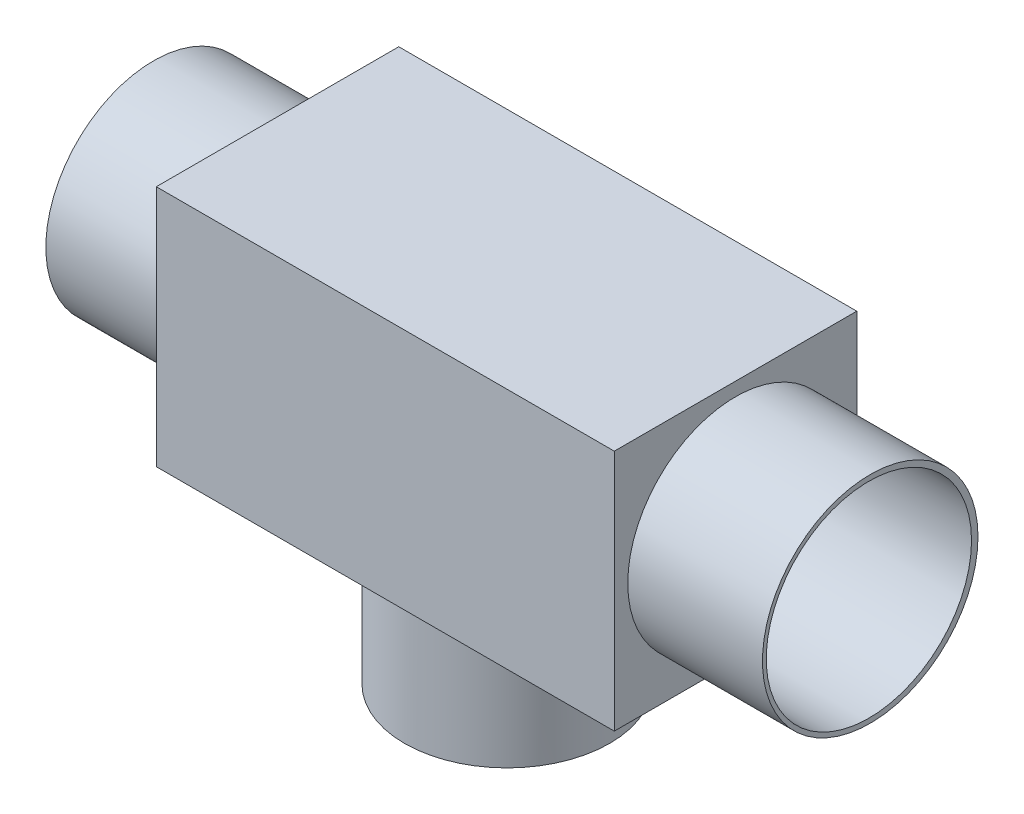
ISO-10303-21;
HEADER;
FILE_DESCRIPTION(('STEP AP214'),'2;1');
FILE_NAME('part.step','',(''),(''),'','','');
FILE_SCHEMA(('AUTOMOTIVE_DESIGN { 1 0 10303 214 1 1 1 1 }'));
ENDSEC;
DATA;
#1=APPLICATION_CONTEXT('core data for automotive mechanical design processes');
#2=APPLICATION_PROTOCOL_DEFINITION('international standard','automotive_design',2000,#1);
#3=PRODUCT_CONTEXT('',#1,'mechanical');
#4=PRODUCT('Part','Part','',(#3));
#5=PRODUCT_RELATED_PRODUCT_CATEGORY('part','',(#4));
#6=PRODUCT_DEFINITION_FORMATION('','',#4);
#7=PRODUCT_DEFINITION_CONTEXT('part definition',#1,'design');
#8=PRODUCT_DEFINITION('design','',#6,#7);
#9=PRODUCT_DEFINITION_SHAPE('','',#8);
#10=(LENGTH_UNIT() NAMED_UNIT(*) SI_UNIT(.MILLI.,.METRE.));
#11=(NAMED_UNIT(*) PLANE_ANGLE_UNIT() SI_UNIT($,.RADIAN.));
#12=(NAMED_UNIT(*) SI_UNIT($,.STERADIAN.) SOLID_ANGLE_UNIT());
#13=UNCERTAINTY_MEASURE_WITH_UNIT(LENGTH_MEASURE(1.E-05),#10,'distance_accuracy_value','');
#14=(GEOMETRIC_REPRESENTATION_CONTEXT(3) GLOBAL_UNCERTAINTY_ASSIGNED_CONTEXT((#13)) GLOBAL_UNIT_ASSIGNED_CONTEXT((#10,
#11,#12)) REPRESENTATION_CONTEXT('',''));
#15=CARTESIAN_POINT('',(0.,0.,0.));
#16=DIRECTION('',(0.,0.,1.));
#17=DIRECTION('',(1.,0.,0.));
#18=AXIS2_PLACEMENT_3D('',#15,#16,#17);
#19=CARTESIAN_POINT('',(-42.5,-22.5,45.));
#20=DIRECTION('',(1.,0.,0.));
#21=DIRECTION('',(0.,0.,-1.));
#22=AXIS2_PLACEMENT_3D('',#19,#20,#21);
#23=PLANE('',#22);
#24=CARTESIAN_POINT('',(-42.5,0.,22.5));
#25=DIRECTION('',(1.,0.,0.));
#26=DIRECTION('',(0.,0.,-1.));
#27=AXIS2_PLACEMENT_3D('',#24,#25,#26);
#28=CIRCLE('',#27,20.);
#29=CARTESIAN_POINT('',(-42.5,0.,2.5));
#30=VERTEX_POINT('',#29);
#31=EDGE_CURVE('E106',#30,#30,#28,.T.);
#32=ORIENTED_EDGE('',*,*,#31,.T.);
#33=EDGE_LOOP('',(#32));
#34=FACE_BOUND('',#33,.T.);
#35=DIRECTION('',(0.,-1.,0.));
#36=VECTOR('',#35,1.);
#37=CARTESIAN_POINT('',(-42.5,-22.5,0.));
#38=LINE('',#37,#36);
#39=CARTESIAN_POINT('',(-42.5,22.5,0.));
#40=VERTEX_POINT('',#39);
#41=CARTESIAN_POINT('',(-42.5,-22.5,0.));
#42=VERTEX_POINT('',#41);
#43=EDGE_CURVE('E103',#40,#42,#38,.T.);
#44=ORIENTED_EDGE('',*,*,#43,.T.);
#45=DIRECTION('',(0.,0.,-1.));
#46=VECTOR('',#45,1.);
#47=CARTESIAN_POINT('',(-42.5,-22.5,45.));
#48=LINE('',#47,#46);
#49=CARTESIAN_POINT('',(-42.5,-22.5,45.));
#50=VERTEX_POINT('',#49);
#51=EDGE_CURVE('E45',#50,#42,#48,.T.);
#52=ORIENTED_EDGE('',*,*,#51,.F.);
#53=DIRECTION('',(0.,-1.,0.));
#54=VECTOR('',#53,1.);
#55=CARTESIAN_POINT('',(-42.5,-22.5,45.));
#56=LINE('',#55,#54);
#57=CARTESIAN_POINT('',(-42.5,22.5,45.));
#58=VERTEX_POINT('',#57);
#59=EDGE_CURVE('E89',#58,#50,#56,.T.);
#60=ORIENTED_EDGE('',*,*,#59,.F.);
#61=DIRECTION('',(0.,0.,-1.));
#62=VECTOR('',#61,1.);
#63=CARTESIAN_POINT('',(-42.5,22.5,45.));
#64=LINE('',#63,#62);
#65=EDGE_CURVE('E99',#58,#40,#64,.T.);
#66=ORIENTED_EDGE('',*,*,#65,.T.);
#67=EDGE_LOOP('',(#44,#52,#60,#66));
#68=FACE_BOUND('',#67,.T.);
#69=ADVANCED_FACE('F32',(#34,#68),#23,.F.);
#70=CARTESIAN_POINT('',(42.5,-22.5,45.));
#71=DIRECTION('',(0.,1.,0.));
#72=DIRECTION('',(-1.,0.,0.));
#73=AXIS2_PLACEMENT_3D('',#70,#71,#72);
#74=PLANE('',#73);
#75=CARTESIAN_POINT('',(0.,-22.5,22.3958172904845));
#76=DIRECTION('',(0.,1.,0.));
#77=DIRECTION('',(-1.,0.,0.));
#78=AXIS2_PLACEMENT_3D('',#75,#76,#77);
#79=CIRCLE('',#78,19.05);
#80=CARTESIAN_POINT('',(-19.05,-22.5,22.3958172904845));
#81=VERTEX_POINT('',#80);
#82=EDGE_CURVE('E11',#81,#81,#79,.F.);
#83=ORIENTED_EDGE('',*,*,#82,.F.);
#84=EDGE_LOOP('',(#83));
#85=FACE_BOUND('',#84,.T.);
#86=DIRECTION('',(1.,0.,0.));
#87=VECTOR('',#86,1.);
#88=CARTESIAN_POINT('',(42.5,-22.5,0.));
#89=LINE('',#88,#87);
#90=CARTESIAN_POINT('',(42.5,-22.5,0.));
#91=VERTEX_POINT('',#90);
#92=EDGE_CURVE('E94',#42,#91,#89,.T.);
#93=ORIENTED_EDGE('',*,*,#92,.T.);
#94=DIRECTION('',(0.,0.,-1.));
#95=VECTOR('',#94,1.);
#96=CARTESIAN_POINT('',(42.5,-22.5,45.));
#97=LINE('',#96,#95);
#98=CARTESIAN_POINT('',(42.5,-22.5,45.));
#99=VERTEX_POINT('',#98);
#100=EDGE_CURVE('E92',#99,#91,#97,.T.);
#101=ORIENTED_EDGE('',*,*,#100,.F.);
#102=DIRECTION('',(1.,0.,0.));
#103=VECTOR('',#102,1.);
#104=CARTESIAN_POINT('',(42.5,-22.5,45.));
#105=LINE('',#104,#103);
#106=EDGE_CURVE('E84',#50,#99,#105,.T.);
#107=ORIENTED_EDGE('',*,*,#106,.F.);
#108=ORIENTED_EDGE('',*,*,#51,.T.);
#109=EDGE_LOOP('',(#93,#101,#107,#108));
#110=FACE_BOUND('',#109,.T.);
#111=ADVANCED_FACE('F93',(#85,#110),#74,.F.);
#112=CARTESIAN_POINT('',(42.5,-22.5,45.));
#113=DIRECTION('',(-1.,0.,0.));
#114=DIRECTION('',(0.,0.,1.));
#115=AXIS2_PLACEMENT_3D('',#112,#113,#114);
#116=PLANE('',#115);
#117=CARTESIAN_POINT('',(42.5,0.,22.5));
#118=DIRECTION('',(-1.,0.,0.));
#119=DIRECTION('',(0.,0.,1.));
#120=AXIS2_PLACEMENT_3D('',#117,#118,#119);
#121=CIRCLE('',#120,20.);
#122=CARTESIAN_POINT('',(42.5,0.,42.5));
#123=VERTEX_POINT('',#122);
#124=EDGE_CURVE('E113',#123,#123,#121,.T.);
#125=ORIENTED_EDGE('',*,*,#124,.T.);
#126=EDGE_LOOP('',(#125));
#127=FACE_BOUND('',#126,.T.);
#128=DIRECTION('',(0.,1.,0.));
#129=VECTOR('',#128,1.);
#130=CARTESIAN_POINT('',(42.5,-22.5,0.));
#131=LINE('',#130,#129);
#132=CARTESIAN_POINT('',(42.5,22.5,0.));
#133=VERTEX_POINT('',#132);
#134=EDGE_CURVE('E70',#91,#133,#131,.T.);
#135=ORIENTED_EDGE('',*,*,#134,.T.);
#136=DIRECTION('',(0.,0.,-1.));
#137=VECTOR('',#136,1.);
#138=CARTESIAN_POINT('',(42.5,22.5,45.));
#139=LINE('',#138,#137);
#140=CARTESIAN_POINT('',(42.5,22.5,45.));
#141=VERTEX_POINT('',#140);
#142=EDGE_CURVE('E95',#141,#133,#139,.T.);
#143=ORIENTED_EDGE('',*,*,#142,.F.);
#144=DIRECTION('',(0.,1.,0.));
#145=VECTOR('',#144,1.);
#146=CARTESIAN_POINT('',(42.5,-22.5,45.));
#147=LINE('',#146,#145);
#148=EDGE_CURVE('E87',#99,#141,#147,.T.);
#149=ORIENTED_EDGE('',*,*,#148,.F.);
#150=ORIENTED_EDGE('',*,*,#100,.T.);
#151=EDGE_LOOP('',(#135,#143,#149,#150));
#152=FACE_BOUND('',#151,.T.);
#153=ADVANCED_FACE('F97',(#127,#152),#116,.F.);
#154=CARTESIAN_POINT('',(42.5,22.5,45.));
#155=DIRECTION('',(0.,-1.,0.));
#156=DIRECTION('',(1.,0.,0.));
#157=AXIS2_PLACEMENT_3D('',#154,#155,#156);
#158=PLANE('',#157);
#159=DIRECTION('',(-1.,0.,0.));
#160=VECTOR('',#159,1.);
#161=CARTESIAN_POINT('',(42.5,22.5,0.));
#162=LINE('',#161,#160);
#163=EDGE_CURVE('E76',#133,#40,#162,.T.);
#164=ORIENTED_EDGE('',*,*,#163,.T.);
#165=ORIENTED_EDGE('',*,*,#65,.F.);
#166=DIRECTION('',(-1.,0.,0.));
#167=VECTOR('',#166,1.);
#168=CARTESIAN_POINT('',(42.5,22.5,45.));
#169=LINE('',#168,#167);
#170=EDGE_CURVE('E53',#141,#58,#169,.T.);
#171=ORIENTED_EDGE('',*,*,#170,.F.);
#172=ORIENTED_EDGE('',*,*,#142,.T.);
#173=EDGE_LOOP('',(#164,#165,#171,#172));
#174=FACE_BOUND('',#173,.T.);
#175=ADVANCED_FACE('F187',(#174),#158,.F.);
#176=CARTESIAN_POINT('',(0.,0.,45.));
#177=DIRECTION('',(0.,0.,1.));
#178=DIRECTION('',(1.,0.,0.));
#179=AXIS2_PLACEMENT_3D('',#176,#177,#178);
#180=PLANE('',#179);
#181=ORIENTED_EDGE('',*,*,#59,.T.);
#182=ORIENTED_EDGE('',*,*,#106,.T.);
#183=ORIENTED_EDGE('',*,*,#148,.T.);
#184=ORIENTED_EDGE('',*,*,#170,.T.);
#185=EDGE_LOOP('',(#181,#182,#183,#184));
#186=FACE_BOUND('',#185,.T.);
#187=ADVANCED_FACE('F85',(#186),#180,.T.);
#188=CARTESIAN_POINT('',(0.,0.,0.));
#189=DIRECTION('',(0.,0.,1.));
#190=DIRECTION('',(1.,0.,0.));
#191=AXIS2_PLACEMENT_3D('',#188,#189,#190);
#192=PLANE('',#191);
#193=ORIENTED_EDGE('',*,*,#43,.F.);
#194=ORIENTED_EDGE('',*,*,#163,.F.);
#195=ORIENTED_EDGE('',*,*,#134,.F.);
#196=ORIENTED_EDGE('',*,*,#92,.F.);
#197=EDGE_LOOP('',(#193,#194,#195,#196));
#198=FACE_BOUND('',#197,.T.);
#199=ADVANCED_FACE('F178',(#198),#192,.F.);
#200=CARTESIAN_POINT('',(67.5,0.,22.5));
#201=DIRECTION('',(1.,0.,0.));
#202=DIRECTION('',(0.,0.,-1.));
#203=AXIS2_PLACEMENT_3D('',#200,#201,#202);
#204=PLANE('',#203);
#205=CARTESIAN_POINT('',(67.5,0.,22.75));
#206=DIRECTION('',(1.,0.,0.));
#207=DIRECTION('',(0.,0.,-1.));
#208=AXIS2_PLACEMENT_3D('',#205,#206,#207);
#209=CIRCLE('',#208,19.05);
#210=CARTESIAN_POINT('',(67.5,0.,3.7));
#211=VERTEX_POINT('',#210);
#212=EDGE_CURVE('E137',#211,#211,#209,.T.);
#213=ORIENTED_EDGE('',*,*,#212,.F.);
#214=EDGE_LOOP('',(#213));
#215=FACE_BOUND('',#214,.T.);
#216=CARTESIAN_POINT('',(67.5,0.,22.5));
#217=DIRECTION('',(1.,0.,0.));
#218=DIRECTION('',(0.,0.,-1.));
#219=AXIS2_PLACEMENT_3D('',#216,#217,#218);
#220=CIRCLE('',#219,20.);
#221=CARTESIAN_POINT('',(67.5,0.,2.5));
#222=VERTEX_POINT('',#221);
#223=EDGE_CURVE('E121',#222,#222,#220,.T.);
#224=ORIENTED_EDGE('',*,*,#223,.T.);
#225=EDGE_LOOP('',(#224));
#226=FACE_BOUND('',#225,.T.);
#227=ADVANCED_FACE('F180',(#215,#226),#204,.T.);
#228=CARTESIAN_POINT('',(-65.5,0.,22.5));
#229=DIRECTION('',(1.,0.,0.));
#230=DIRECTION('',(0.,0.,-1.));
#231=AXIS2_PLACEMENT_3D('',#228,#229,#230);
#232=CYLINDRICAL_SURFACE('',#231,20.);
#233=ORIENTED_EDGE('',*,*,#223,.F.);
#234=EDGE_LOOP('',(#233));
#235=FACE_BOUND('',#234,.T.);
#236=ORIENTED_EDGE('',*,*,#124,.F.);
#237=EDGE_LOOP('',(#236));
#238=FACE_BOUND('',#237,.T.);
#239=ADVANCED_FACE('F165',(#235,#238),#232,.T.);
#240=CARTESIAN_POINT('',(-65.5,0.,22.5));
#241=DIRECTION('',(1.,0.,0.));
#242=DIRECTION('',(0.,0.,-1.));
#243=AXIS2_PLACEMENT_3D('',#240,#241,#242);
#244=CIRCLE('',#243,20.);
#245=CARTESIAN_POINT('',(-65.5,0.,2.5));
#246=VERTEX_POINT('',#245);
#247=EDGE_CURVE('E115',#246,#246,#244,.T.);
#248=ORIENTED_EDGE('',*,*,#247,.T.);
#249=EDGE_LOOP('',(#248));
#250=FACE_BOUND('',#249,.T.);
#251=ORIENTED_EDGE('',*,*,#31,.F.);
#252=EDGE_LOOP('',(#251));
#253=FACE_BOUND('',#252,.T.);
#254=ADVANCED_FACE('F156',(#250,#253),#232,.T.);
#255=CARTESIAN_POINT('',(-65.5,0.,22.5));
#256=DIRECTION('',(1.,0.,0.));
#257=DIRECTION('',(0.,0.,-1.));
#258=AXIS2_PLACEMENT_3D('',#255,#256,#257);
#259=PLANE('',#258);
#260=CARTESIAN_POINT('',(-65.5,0.,22.75));
#261=DIRECTION('',(1.,0.,0.));
#262=DIRECTION('',(0.,0.,-1.));
#263=AXIS2_PLACEMENT_3D('',#260,#261,#262);
#264=CIRCLE('',#263,19.05);
#265=CARTESIAN_POINT('',(-65.5,0.,3.7));
#266=VERTEX_POINT('',#265);
#267=EDGE_CURVE('E134',#266,#266,#264,.T.);
#268=ORIENTED_EDGE('',*,*,#267,.T.);
#269=EDGE_LOOP('',(#268));
#270=FACE_BOUND('',#269,.T.);
#271=ORIENTED_EDGE('',*,*,#247,.F.);
#272=EDGE_LOOP('',(#271));
#273=FACE_BOUND('',#272,.T.);
#274=ADVANCED_FACE('F152',(#270,#273),#259,.F.);
#275=CARTESIAN_POINT('',(0.,-47.5,22.3958172904845));
#276=DIRECTION('',(0.,1.,0.));
#277=DIRECTION('',(-1.,0.,0.));
#278=AXIS2_PLACEMENT_3D('',#275,#276,#277);
#279=CYLINDRICAL_SURFACE('',#278,19.05);
#280=CARTESIAN_POINT('',(0.,-47.5,22.3958172904845));
#281=DIRECTION('',(0.,-1.,0.));
#282=DIRECTION('',(1.,0.,0.));
#283=AXIS2_PLACEMENT_3D('',#280,#281,#282);
#284=CIRCLE('',#283,19.05);
#285=CARTESIAN_POINT('',(19.05,-47.5,22.3958172904845));
#286=VERTEX_POINT('',#285);
#287=EDGE_CURVE('E126',#286,#286,#284,.T.);
#288=ORIENTED_EDGE('',*,*,#287,.F.);
#289=EDGE_LOOP('',(#288));
#290=FACE_BOUND('',#289,.T.);
#291=ORIENTED_EDGE('',*,*,#82,.T.);
#292=EDGE_LOOP('',(#291));
#293=FACE_BOUND('',#292,.T.);
#294=ADVANCED_FACE('F155',(#290,#293),#279,.T.);
#295=CARTESIAN_POINT('',(0.,-47.5,22.3958172904845));
#296=DIRECTION('',(0.,-1.,0.));
#297=DIRECTION('',(1.,0.,0.));
#298=AXIS2_PLACEMENT_3D('',#295,#296,#297);
#299=PLANE('',#298);
#300=CARTESIAN_POINT('',(0.,-47.5,22.6458172904845));
#301=DIRECTION('',(0.,-1.,0.));
#302=DIRECTION('',(1.,0.,0.));
#303=AXIS2_PLACEMENT_3D('',#300,#301,#302);
#304=CIRCLE('',#303,16.9618550778018);
#305=CARTESIAN_POINT('',(16.9618550778018,-47.5,22.6458172904845));
#306=VERTEX_POINT('',#305);
#307=EDGE_CURVE('E131',#306,#306,#304,.T.);
#308=ORIENTED_EDGE('',*,*,#307,.F.);
#309=EDGE_LOOP('',(#308));
#310=FACE_BOUND('',#309,.T.);
#311=ORIENTED_EDGE('',*,*,#287,.T.);
#312=EDGE_LOOP('',(#311));
#313=FACE_BOUND('',#312,.T.);
#314=ADVANCED_FACE('F162',(#310,#313),#299,.T.);
#315=CARTESIAN_POINT('',(0.,-2.5,22.6458172904845));
#316=DIRECTION('',(0.,-1.,0.));
#317=DIRECTION('',(1.,0.,0.));
#318=AXIS2_PLACEMENT_3D('',#315,#316,#317);
#319=CYLINDRICAL_SURFACE('',#318,16.9618550778018);
#320=CARTESIAN_POINT('',(16.9618550778018,-19.0497151150099,22.6458172904845));
#321=CARTESIAN_POINT('',(16.9618525636393,-19.0475528766194,22.2509086043512));
#322=CARTESIAN_POINT('',(16.9480376678515,-19.0330891948783,21.8560264169823));
#323=CARTESIAN_POINT('',(16.893067345848,-18.9798414617284,21.0696575597544));
#324=CARTESIAN_POINT('',(16.8518981589328,-18.9410451702416,20.6781726994023));
#325=CARTESIAN_POINT('',(16.7429458640347,-18.8398800515017,19.901289736641));
#326=CARTESIAN_POINT('',(16.6751141089562,-18.7774681442805,19.5159041072024));
#327=CARTESIAN_POINT('',(16.5141259911321,-18.6303963143862,18.7548721005969));
#328=CARTESIAN_POINT('',(16.4209722258754,-18.5457386736724,18.379224728823));
#329=CARTESIAN_POINT('',(16.2116551458752,-18.3564810180456,17.6425798477718));
#330=CARTESIAN_POINT('',(16.0956559361829,-18.252023421675,17.2814987873231));
#331=CARTESIAN_POINT('',(15.8419713893965,-18.0246128837612,16.5730875934139));
#332=CARTESIAN_POINT('',(15.7042859795744,-17.9016598801909,16.2257575060744));
#333=CARTESIAN_POINT('',(15.4090224647805,-17.6391953808685,15.5462562082818));
#334=CARTESIAN_POINT('',(15.2514477150273,-17.4996866782056,15.2140824538794));
#335=CARTESIAN_POINT('',(14.9180870930616,-17.2060050775148,14.565708902989));
#336=CARTESIAN_POINT('',(14.7422971472571,-17.0518288999305,14.2495127032963));
#337=CARTESIAN_POINT('',(14.3009205320117,-16.6668605920553,13.5112938160718));
#338=CARTESIAN_POINT('',(14.02741232884,-16.4299714340467,13.0971566166211));
#339=CARTESIAN_POINT('',(13.4517994163403,-15.9361487927989,12.3019911235252));
#340=CARTESIAN_POINT('',(13.1496841556172,-15.6792079198996,11.9209751464397));
#341=CARTESIAN_POINT('',(12.5192949342491,-15.1493852924312,11.1913532142039));
#342=CARTESIAN_POINT('',(12.1909634251194,-14.8764688399714,10.8428224144827));
#343=CARTESIAN_POINT('',(11.5110923932324,-14.3197960745019,10.1788582996552));
#344=CARTESIAN_POINT('',(11.1595560067131,-14.0360412285227,9.86342052674627));
#345=CARTESIAN_POINT('',(10.4262992931427,-13.4556255712903,9.25821060163892));
#346=CARTESIAN_POINT('',(10.044070464988,-13.1588180316715,8.96919629430188));
#347=CARTESIAN_POINT('',(9.25715183351357,-12.5639312170932,8.42475149074414));
#348=CARTESIAN_POINT('',(8.85245546653209,-12.2658515942353,8.1693308827826));
#349=CARTESIAN_POINT('',(8.02072468753239,-11.6755011699722,7.69249053943134));
#350=CARTESIAN_POINT('',(7.59373424329746,-11.3832203952355,7.47100703516715));
#351=CARTESIAN_POINT('',(6.93466453334884,-10.9555120212079,7.16442497005898));
#352=CARTESIAN_POINT('',(6.71192295236491,-10.814754675706,7.06652155971395));
#353=CARTESIAN_POINT('',(6.25978926123623,-10.5382561622914,6.87941486402641));
#354=CARTESIAN_POINT('',(6.03039817528686,-10.402514229125,6.7902102479851));
#355=CARTESIAN_POINT('',(5.56695529578701,-10.1391944278397,6.62165786363858));
#356=CARTESIAN_POINT('',(5.33297844335481,-10.0115454041776,6.54221583398204));
#357=CARTESIAN_POINT('',(4.8576213834124,-9.76502342642703,6.39250625675075));
#358=CARTESIAN_POINT('',(4.61624300247921,-9.64614833135815,6.32223646776325));
#359=CARTESIAN_POINT('',(4.12579771645924,-9.41984655977952,6.19143547318491));
#360=CARTESIAN_POINT('',(3.87673687423657,-9.31241113904536,6.13089681104093));
#361=CARTESIAN_POINT('',(3.37055311236166,-9.11205638031055,6.02020520652958));
#362=CARTESIAN_POINT('',(3.11343147721694,-9.0191347434782,5.97005061902279));
#363=CARTESIAN_POINT('',(2.63457848549915,-8.86532093128165,5.88836075296294));
#364=CARTESIAN_POINT('',(2.41402879189098,-8.80167312660205,5.85511788300255));
#365=CARTESIAN_POINT('',(1.96810251612819,-8.68926557399286,5.79703043641658));
#366=CARTESIAN_POINT('',(1.74272748250201,-8.64050112418005,5.77218320721138));
#367=CARTESIAN_POINT('',(1.28858092004712,-8.55998723505138,5.73144639614978));
#368=CARTESIAN_POINT('',(1.05981699187551,-8.5282043284286,5.71553919201403));
#369=CARTESIAN_POINT('',(0.600005539352025,-8.48306722239136,5.69301554239411));
#370=CARTESIAN_POINT('',(0.368958121341853,-8.46971216883012,5.68639866629502));
#371=CARTESIAN_POINT('',(-0.0944362212183495,-8.46212888216024,5.6826365268194));
#372=CARTESIAN_POINT('',(-0.326784697858161,-8.46797551379843,5.68552833656198));
#373=CARTESIAN_POINT('',(-0.789897098080949,-8.49864042861015,5.70078022489804));
#374=CARTESIAN_POINT('',(-1.02066097884398,-8.52345922244167,5.71314055834797));
#375=CARTESIAN_POINT('',(-1.47927302570038,-8.59084840498034,5.74702286184738));
#376=CARTESIAN_POINT('',(-1.70711545681392,-8.63344943033349,5.76856064487926));
#377=CARTESIAN_POINT('',(-2.15829130658934,-8.7344767203336,5.82030340739991));
#378=CARTESIAN_POINT('',(-2.38162294252267,-8.79290911515866,5.85051174454577));
#379=CARTESIAN_POINT('',(-2.9282812556002,-8.95450066392281,5.93538647824818));
#380=CARTESIAN_POINT('',(-3.24848971472591,-9.06569927835008,5.99484604128768));
#381=CARTESIAN_POINT('',(-3.87660801875549,-9.31074682474707,6.12977038610255));
#382=CARTESIAN_POINT('',(-4.18451031583094,-9.44460940164205,6.20524481666455));
#383=CARTESIAN_POINT('',(-4.78940047394053,-9.72949024246914,6.37114810267892));
#384=CARTESIAN_POINT('',(-5.08634627623799,-9.88056701869232,6.46162846941307));
#385=CARTESIAN_POINT('',(-5.66901025541187,-10.1947520757827,6.65640798205449));
#386=CARTESIAN_POINT('',(-5.95472942739035,-10.3578592865965,6.76070589960778));
#387=CARTESIAN_POINT('',(-6.48901117335041,-10.6764712410665,6.97190036394833));
#388=CARTESIAN_POINT('',(-6.73851229825817,-10.8312089448566,7.07759226517951));
#389=CARTESIAN_POINT('',(-7.22968401827681,-11.1455048062518,7.29952141734102));
#390=CARTESIAN_POINT('',(-7.47135346362687,-11.3050636650608,7.41576020721612));
#391=CARTESIAN_POINT('',(-8.18555191165484,-11.7885275651955,7.78017285742312));
#392=CARTESIAN_POINT('',(-8.64706978232562,-12.1170965590676,8.04396284611856));
#393=CARTESIAN_POINT('',(-9.54229685870783,-12.7760436774949,8.61263983317));
#394=CARTESIAN_POINT('',(-9.97601223657286,-13.1064213827158,8.91751766307381));
#395=CARTESIAN_POINT('',(-10.8156384712068,-13.7612284450941,9.56879334765874));
#396=CARTESIAN_POINT('',(-11.2215612692595,-14.0856603124849,9.91517319253451));
#397=CARTESIAN_POINT('',(-11.9392192675508,-14.6691505680697,10.5892813731389));
#398=CARTESIAN_POINT('',(-12.2554191003359,-14.9301366776257,10.9105969544416));
#399=CARTESIAN_POINT('',(-12.8656657582176,-15.4395314845671,11.5830288045149));
#400=CARTESIAN_POINT('',(-13.1597116857483,-15.6879396722241,11.9341462794855));
#401=CARTESIAN_POINT('',(-13.7227208119539,-16.1678402611792,12.6656315853641));
#402=CARTESIAN_POINT('',(-13.9917254163112,-16.3993604443712,13.0459491626521));
#403=CARTESIAN_POINT('',(-14.5021315233266,-16.841825657085,13.8359535490498));
#404=CARTESIAN_POINT('',(-14.7435403715745,-17.0527761597495,14.2456324951282));
#405=CARTESIAN_POINT('',(-15.145366532038,-17.4060061662038,14.9997390015502));
#406=CARTESIAN_POINT('',(-15.3119037678463,-17.5531698665626,15.3386296770125));
#407=CARTESIAN_POINT('',(-15.624174400496,-17.8302775484167,16.0326177573004));
#408=CARTESIAN_POINT('',(-15.7699125476733,-17.9602254613646,16.3877114369679));
#409=CARTESIAN_POINT('',(-16.0386446014154,-18.2007894512051,17.112663547066));
#410=CARTESIAN_POINT('',(-16.1616450519093,-18.3114110897115,17.4825176920462));
#411=CARTESIAN_POINT('',(-16.3830583302337,-18.5113594999661,18.2351734751814));
#412=CARTESIAN_POINT('',(-16.4814708424194,-18.6006859983395,18.6179752794789));
#413=CARTESIAN_POINT('',(-16.6525839220107,-18.7567974653648,19.3968101730366));
#414=CARTESIAN_POINT('',(-16.7250958045512,-18.8234168594059,19.7929182427948));
#415=CARTESIAN_POINT('',(-16.8419814910103,-18.9317502633729,20.5926555399973));
#416=CARTESIAN_POINT('',(-16.8863552284499,-18.9734642144573,20.9962847852088));
#417=CARTESIAN_POINT('',(-16.9459966144211,-19.0310050416066,21.807362732144));
#418=CARTESIAN_POINT('',(-16.9612764470924,-19.0468427539009,22.2148097631576));
#419=CARTESIAN_POINT('',(-16.9624012533509,-19.0523019417722,23.0298992941778));
#420=CARTESIAN_POINT('',(-16.9482489101087,-19.0419258071037,23.4375417729794));
#421=CARTESIAN_POINT('',(-16.8940238379462,-18.9978830055462,24.2037197149169));
#422=CARTESIAN_POINT('',(-16.8570337114374,-18.9669567906814,24.5626388043956));
#423=CARTESIAN_POINT('',(-16.7606797034489,-18.8853040157765,25.2751430992708));
#424=CARTESIAN_POINT('',(-16.7013178460796,-18.8345792470208,25.6287287842046));
#425=CARTESIAN_POINT('',(-16.5611216765933,-18.7142696678286,26.3283560997497));
#426=CARTESIAN_POINT('',(-16.4802856179725,-18.6446833233647,26.6743971142723));
#427=CARTESIAN_POINT('',(-16.2982866731968,-18.4878549659685,27.3569919985121));
#428=CARTESIAN_POINT('',(-16.1971226532317,-18.4006119682186,27.6935453378512));
#429=CARTESIAN_POINT('',(-15.9721246106649,-18.2067158593438,28.3664583580995));
#430=CARTESIAN_POINT('',(-15.8476546025587,-18.099518892617,28.7024478762195));
#431=CARTESIAN_POINT('',(-15.5799210508524,-17.8694051557491,29.3612499394172));
#432=CARTESIAN_POINT('',(-15.4366576549189,-17.7464885091235,29.6840625880043));
#433=CARTESIAN_POINT('',(-15.1328051474648,-17.4865899463012,30.3155988756573));
#434=CARTESIAN_POINT('',(-14.9722134280099,-17.3496059130954,30.624320384012));
#435=CARTESIAN_POINT('',(-14.6351275601796,-17.0632412336591,31.2270083471864));
#436=CARTESIAN_POINT('',(-14.4586300882451,-16.9138579970918,31.5209716981668));
#437=CARTESIAN_POINT('',(-13.9992990378485,-16.5270610408101,32.2366640390705));
#438=CARTESIAN_POINT('',(-13.7073504234175,-16.2829154907534,32.6489541547193));
#439=CARTESIAN_POINT('',(-13.0944307192774,-15.7756304904881,33.4388973530618));
#440=CARTESIAN_POINT('',(-12.7734471586381,-15.5124828885047,33.8165354105678));
#441=CARTESIAN_POINT('',(-12.1044659880396,-14.9714497441014,34.5382201723706));
#442=CARTESIAN_POINT('',(-11.7563908049798,-14.693522660559,34.8821635326611));
#443=CARTESIAN_POINT('',(-11.0361819147315,-14.1287019334736,35.5354882322685));
#444=CARTESIAN_POINT('',(-10.6640524546193,-13.8418098774018,35.8448756466871));
#445=CARTESIAN_POINT('',(-9.88813175984398,-13.2577844429106,36.436126344074));
#446=CARTESIAN_POINT('',(-9.48381884339226,-12.960565467636,36.7172201143767));
#447=CARTESIAN_POINT('',(-8.6508461759165,-12.3685106897341,37.2441203509654));
#448=CARTESIAN_POINT('',(-8.22217569112945,-12.0736760042114,37.4899110891295));
#449=CARTESIAN_POINT('',(-7.34036414479639,-11.4954311417787,37.9451384574288));
#450=CARTESIAN_POINT('',(-6.88729424831971,-11.2119915475125,38.1546740229813));
#451=CARTESIAN_POINT('',(-6.18684042884245,-10.8036880885571,38.4411001102745));
#452=CARTESIAN_POINT('',(-5.94996200013905,-10.6704371507132,38.5319040770459));
#453=CARTESIAN_POINT('',(-5.46873445443556,-10.4114800372074,38.7039237476509));
#454=CARTESIAN_POINT('',(-5.22438689374763,-10.285772305757,38.785141432023));
#455=CARTESIAN_POINT('',(-4.74355543459905,-10.0519058109941,38.9326941371668));
#456=CARTESIAN_POINT('',(-4.50755831661494,-9.943139515105,38.9996468849926));
#457=CARTESIAN_POINT('',(-4.02837377648393,-9.73661700451277,39.1242275529877));
#458=CARTESIAN_POINT('',(-3.78518707965095,-9.63885968393247,39.1818564100179));
#459=CARTESIAN_POINT('',(-3.29196653527028,-9.45722820116362,39.2870596697892));
#460=CARTESIAN_POINT('',(-3.04194440386899,-9.37333183050256,39.3346501908194));
#461=CARTESIAN_POINT('',(-2.5351415624817,-9.22228762555032,39.4191155665844));
#462=CARTESIAN_POINT('',(-2.27836305816449,-9.15513439852563,39.4559938722081));
#463=CARTESIAN_POINT('',(-1.75471814047016,-9.03967243577597,39.5187579029889));
#464=CARTESIAN_POINT('',(-1.4877553134323,-8.9916912562472,39.5444531730429));
#465=CARTESIAN_POINT('',(-0.949755354534591,-8.91893260101698,39.5832073636849));
#466=CARTESIAN_POINT('',(-0.678718788511521,-8.89415193251201,39.5962680230286));
#467=CARTESIAN_POINT('',(-0.135417352900064,-8.86941401379085,39.6093060686962));
#468=CARTESIAN_POINT('',(0.136846238164421,-8.86943511671301,39.6092948640775));
#469=CARTESIAN_POINT('',(0.679912015936936,-8.89425046191505,39.5962161788318));
#470=CARTESIAN_POINT('',(0.950714207472942,-8.91904462230261,39.583148741365));
#471=CARTESIAN_POINT('',(1.44617931725661,-8.98608351322903,39.5474392032169));
#472=CARTESIAN_POINT('',(1.67143915663539,-9.02499563839795,39.5266125130712));
#473=CARTESIAN_POINT('',(2.11795008576478,-9.11767574360781,39.4764242920393));
#474=CARTESIAN_POINT('',(2.33919969713041,-9.17144908818922,39.4470596789699));
#475=CARTESIAN_POINT('',(2.99612990646703,-9.35235404439979,39.346834866742));
#476=CARTESIAN_POINT('',(3.42465624827919,-9.49902022138513,39.2638690833655));
#477=CARTESIAN_POINT('',(4.2445852100627,-9.82290087237313,39.0732048242958));
#478=CARTESIAN_POINT('',(4.63677320519542,-9.99879586027318,38.9665263962473));
#479=CARTESIAN_POINT('',(5.40264145773591,-10.3737868021556,38.7292477949307));
#480=CARTESIAN_POINT('',(5.77630532684896,-10.5729027955737,38.5986269032097));
#481=CARTESIAN_POINT('',(6.50768235749193,-10.9868396891782,38.3145471655397));
#482=CARTESIAN_POINT('',(6.86533224910139,-11.201715314251,38.1610066172553));
#483=CARTESIAN_POINT('',(7.5646108988875,-11.6404842447502,37.8323355956064));
#484=CARTESIAN_POINT('',(7.90624291162945,-11.8643757009748,37.6572095345285));
#485=CARTESIAN_POINT('',(8.71831512382926,-12.4139331942268,37.2058525642289));
#486=CARTESIAN_POINT('',(9.18101129068252,-12.7419846878613,36.9185165195313));
#487=CARTESIAN_POINT('',(10.07728970309,-13.3974263949447,36.3004515082772));
#488=CARTESIAN_POINT('',(10.5108591487373,-13.7248162571273,35.9697036503097));
#489=CARTESIAN_POINT('',(11.3470853176537,-14.3701927331769,35.2651068314778));
#490=CARTESIAN_POINT('',(11.7498030150862,-14.6881970887219,34.8913467410781));
#491=CARTESIAN_POINT('',(12.5227310516782,-15.308147013467,34.0997013543159));
#492=CARTESIAN_POINT('',(12.8929575068107,-15.610100514405,33.6818381626764));
#493=CARTESIAN_POINT('',(13.4978507622852,-16.1090264061394,32.9257191607733));
#494=CARTESIAN_POINT('',(13.7413318970645,-16.3116162507643,32.5981836535346));
#495=CARTESIAN_POINT('',(14.2076286776549,-16.7020977604556,31.9203517052423));
#496=CARTESIAN_POINT('',(14.430445602274,-16.8899903349522,31.5700566749501));
#497=CARTESIAN_POINT('',(14.8529938723428,-17.2480414408471,30.8475314082255));
#498=CARTESIAN_POINT('',(15.052741942308,-17.4182128108976,30.4753173620746));
#499=CARTESIAN_POINT('',(15.4267826334936,-17.7379598637942,29.7098289737623));
#500=CARTESIAN_POINT('',(15.6010800310839,-17.8875394108395,29.3165586022588));
#501=CARTESIAN_POINT('',(15.895696424873,-18.1408701682785,28.5757131476297));
#502=CARTESIAN_POINT('',(16.0201875629386,-18.2481220358094,28.2309906235233));
#503=CARTESIAN_POINT('',(16.2477730400038,-18.4442810936861,27.5294943848568));
#504=CARTESIAN_POINT('',(16.3508714170886,-18.5331917460904,27.1727229594509));
#505=CARTESIAN_POINT('',(16.5340197684361,-18.6909434087735,26.4497004767368));
#506=CARTESIAN_POINT('',(16.6141132301703,-18.7598222893576,26.0834687510506));
#507=CARTESIAN_POINT('',(16.7502013508972,-18.8763662230747,25.3433612894337));
#508=CARTESIAN_POINT('',(16.8062067225113,-18.9240407066957,24.9694890291082));
#509=CARTESIAN_POINT('',(16.8869277818136,-18.991937445013,24.271040789814));
#510=CARTESIAN_POINT('',(16.91499205626,-19.0151280440742,23.9471349789758));
#511=CARTESIAN_POINT('',(16.9524586128398,-19.0449104461577,23.2974194431139));
#512=CARTESIAN_POINT('',(16.9618571519375,-19.0514989200306,22.9716093493596));
#513=CARTESIAN_POINT('',(16.9618550778018,-19.0497151150099,22.6458172904845));
#514=B_SPLINE_CURVE_WITH_KNOTS('',3,(#320,#321,#322,#323,#324,#325,#326,#327,#328,#329,#330,
#331,#332,#333,#334,#335,#336,#337,#338,#339,#340,#341,#342,#343,#344,#345,#346,#347,#348,#349,
#350,#351,#352,#353,#354,#355,#356,#357,#358,#359,#360,#361,#362,#363,#364,#365,#366,#367,#368,
#369,#370,#371,#372,#373,#374,#375,#376,#377,#378,#379,#380,#381,#382,#383,#384,#385,#386,#387,
#388,#389,#390,#391,#392,#393,#394,#395,#396,#397,#398,#399,#400,#401,#402,#403,#404,#405,#406,
#407,#408,#409,#410,#411,#412,#413,#414,#415,#416,#417,#418,#419,#420,#421,#422,#423,#424,#425,
#426,#427,#428,#429,#430,#431,#432,#433,#434,#435,#436,#437,#438,#439,#440,#441,#442,#443,#444,
#445,#446,#447,#448,#449,#450,#451,#452,#453,#454,#455,#456,#457,#458,#459,#460,#461,#462,#463,
#464,#465,#466,#467,#468,#469,#470,#471,#472,#473,#474,#475,#476,#477,#478,#479,#480,#481,#482,
#483,#484,#485,#486,#487,#488,#489,#490,#491,#492,#493,#494,#495,#496,#497,#498,#499,#500,#501,
#502,#503,#504,#505,#506,#507,#508,#509,#510,#511,#512,#513),.UNSPECIFIED.,.T.,.F.,(4,2,2,2,2,2,
2,2,2,2,2,2,2,2,2,2,2,2,2,2,2,2,2,2,2,2,2,2,2,2,2,2,2,2,2,2,2,2,2,2,2,2,2,2,2,2,2,2,2,2,2,2,2,2,
2,2,2,2,2,2,2,2,2,2,2,2,2,2,2,2,2,2,2,2,2,2,2,2,2,2,2,2,2,2,2,2,2,2,2,2,2,2,2,2,2,2,4),(0.,
1.18438666318668,2.36936958897681,3.55652468260948,4.74355804581017,5.92235671122401,
7.10115933000531,8.27976335659312,9.45863153387878,11.1060231900688,12.7540248529341,
14.4057491986964,16.0572507621489,17.7467643586222,19.4367741534033,21.1235683611703,
21.9666336986384,22.8095698651299,23.6435918764834,24.4774096954887,25.3105855174686,
26.1436292389901,26.8388691255121,27.5338891470584,28.2275343195839,28.921147339981,
29.6174678682741,30.3138071395107,31.0113511039797,31.7091655564313,32.7398463213952,
33.771149832709,34.806069723456,35.8408976734519,36.7766584086527,37.7125559052361,
39.585096306996,41.4572195547354,43.3285333168264,44.8899079481516,46.4513458046179,
48.0101541842402,49.5685466606909,50.7832309418369,51.9976373538709,53.2116937126869,
54.4257656560166,55.6485098583304,56.8712569494829,58.0934918577223,59.3156153463721,
60.4007773117029,61.4858411191969,62.5709932023169,63.6562058275749,64.7770977827779,
65.8979809312484,67.0190330099488,68.1403198817036,69.8211069630808,71.5026194262233,
73.1891375511423,74.8753587098015,76.5992588519,78.3239246552577,80.0438071968215,
80.9031856221062,81.7623861867511,82.5669959100976,83.3715247362918,84.1747517492458,
84.9777197187801,85.7938733393159,86.6099146260605,87.4252436765944,88.2405700319028,
88.9284813380924,89.6166412886841,90.9939724630367,92.3207282345222,93.6486375724997,
94.9813988766089,96.3138882018722,98.2190554051087,100.125054441136,102.0271837739,
103.928364235715,105.29415040053,106.659851986966,108.024557164369,109.389005895212,
110.533516665385,111.677811201443,112.81992815902,113.96153665995,114.938436964237,
115.915533146349),.UNSPECIFIED.);
#515=CARTESIAN_POINT('',(16.9618550778018,-19.0497151150099,22.6458172904845));
#516=VERTEX_POINT('',#515);
#517=EDGE_CURVE('E35',#516,#516,#514,.T.);
#518=ORIENTED_EDGE('',*,*,#517,.T.);
#519=EDGE_LOOP('',(#518));
#520=FACE_BOUND('',#519,.T.);
#521=ORIENTED_EDGE('',*,*,#307,.T.);
#522=EDGE_LOOP('',(#521));
#523=FACE_BOUND('',#522,.T.);
#524=ADVANCED_FACE('F144',(#520,#523),#319,.F.);
#525=CARTESIAN_POINT('',(-91.5000000000001,0.,22.75));
#526=DIRECTION('',(1.,0.,0.));
#527=DIRECTION('',(0.,0.,-1.));
#528=AXIS2_PLACEMENT_3D('',#525,#526,#527);
#529=CYLINDRICAL_SURFACE('',#528,19.05);
#530=ORIENTED_EDGE('',*,*,#517,.F.);
#531=EDGE_LOOP('',(#530));
#532=FACE_BOUND('',#531,.T.);
#533=ORIENTED_EDGE('',*,*,#212,.T.);
#534=EDGE_LOOP('',(#533));
#535=FACE_BOUND('',#534,.T.);
#536=ORIENTED_EDGE('',*,*,#267,.F.);
#537=EDGE_LOOP('',(#536));
#538=FACE_BOUND('',#537,.T.);
#539=ADVANCED_FACE('F147',(#532,#535,#538),#529,.F.);
#540=CLOSED_SHELL('',(#69,#111,#153,#175,#187,#199,#227,#239,#254,#274,#294,#314,#524,#539));
#541=MANIFOLD_SOLID_BREP('B2',#540);
#542=ADVANCED_BREP_SHAPE_REPRESENTATION('',(#18,#541),#14);
#543=SHAPE_DEFINITION_REPRESENTATION(#9,#542);
ENDSEC;
END-ISO-10303-21;
